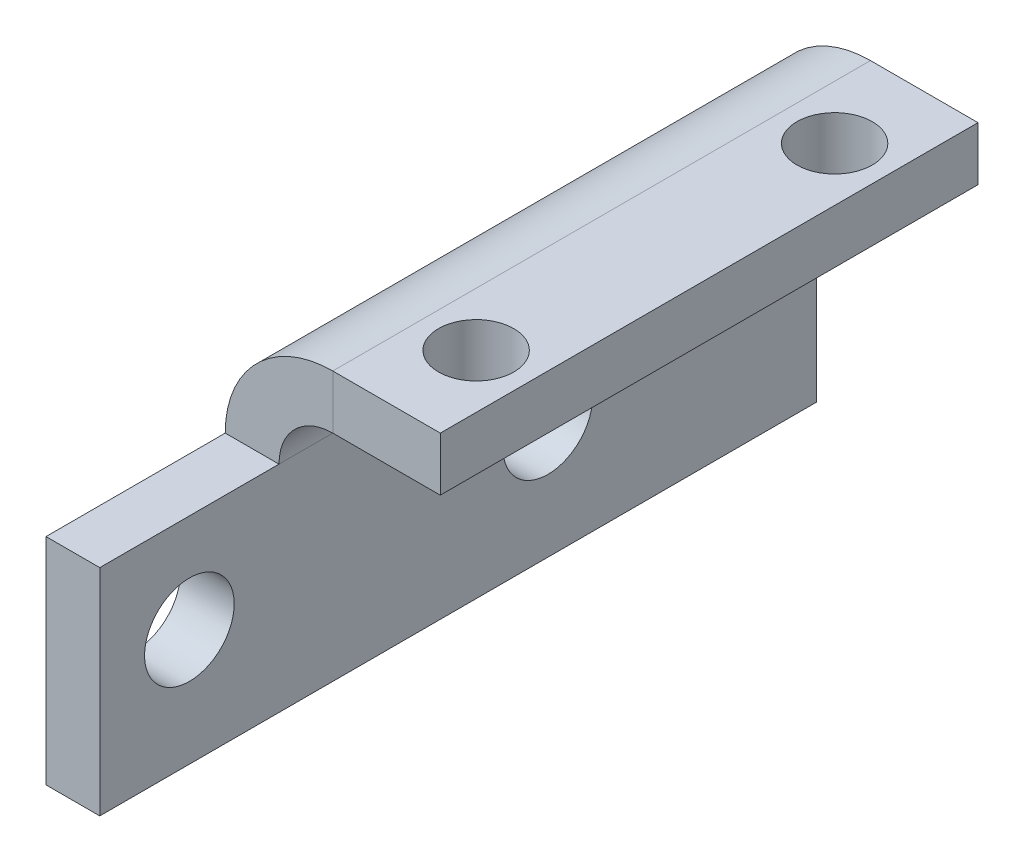
ISO-10303-21;
HEADER;
FILE_DESCRIPTION(('STEP AP214'),'2;1');
FILE_NAME('part.step','',(''),(''),'','','');
FILE_SCHEMA(('AUTOMOTIVE_DESIGN { 1 0 10303 214 1 1 1 1 }'));
ENDSEC;
DATA;
#1=APPLICATION_CONTEXT('core data for automotive mechanical design processes');
#2=APPLICATION_PROTOCOL_DEFINITION('international standard','automotive_design',2000,#1);
#3=PRODUCT_CONTEXT('',#1,'mechanical');
#4=PRODUCT('Part','Part','',(#3));
#5=PRODUCT_RELATED_PRODUCT_CATEGORY('part','',(#4));
#6=PRODUCT_DEFINITION_FORMATION('','',#4);
#7=PRODUCT_DEFINITION_CONTEXT('part definition',#1,'design');
#8=PRODUCT_DEFINITION('design','',#6,#7);
#9=PRODUCT_DEFINITION_SHAPE('','',#8);
#10=(LENGTH_UNIT() NAMED_UNIT(*) SI_UNIT(.MILLI.,.METRE.));
#11=(NAMED_UNIT(*) PLANE_ANGLE_UNIT() SI_UNIT($,.RADIAN.));
#12=(NAMED_UNIT(*) SI_UNIT($,.STERADIAN.) SOLID_ANGLE_UNIT());
#13=UNCERTAINTY_MEASURE_WITH_UNIT(LENGTH_MEASURE(1.E-05),#10,'distance_accuracy_value','');
#14=(GEOMETRIC_REPRESENTATION_CONTEXT(3) GLOBAL_UNCERTAINTY_ASSIGNED_CONTEXT((#13)) GLOBAL_UNIT_ASSIGNED_CONTEXT((#10,
#11,#12)) REPRESENTATION_CONTEXT('',''));
#15=CARTESIAN_POINT('',(0.,0.,0.));
#16=DIRECTION('',(0.,0.,1.));
#17=DIRECTION('',(1.,0.,0.));
#18=AXIS2_PLACEMENT_3D('',#15,#16,#17);
#19=CARTESIAN_POINT('',(-3.,18.,0.));
#20=DIRECTION('',(0.,-1.,0.));
#21=DIRECTION('',(0.,0.,1.));
#22=AXIS2_PLACEMENT_3D('',#19,#20,#21);
#23=PLANE('',#22);
#24=DIRECTION('',(0.,0.,1.));
#25=VECTOR('',#24,1.);
#26=CARTESIAN_POINT('',(-3.,18.,0.));
#27=LINE('',#26,#25);
#28=CARTESIAN_POINT('',(-3.,18.,-30.));
#29=VERTEX_POINT('',#28);
#30=CARTESIAN_POINT('',(-3.,18.,10.));
#31=VERTEX_POINT('',#30);
#32=EDGE_CURVE('E164',#29,#31,#27,.T.);
#33=ORIENTED_EDGE('',*,*,#32,.F.);
#34=DIRECTION('',(-1.,0.,0.));
#35=VECTOR('',#34,1.);
#36=CARTESIAN_POINT('',(-3.,18.,-30.));
#37=LINE('',#36,#35);
#38=CARTESIAN_POINT('',(0.,18.,-30.));
#39=VERTEX_POINT('',#38);
#40=EDGE_CURVE('E57',#39,#29,#37,.T.);
#41=ORIENTED_EDGE('',*,*,#40,.F.);
#42=DIRECTION('',(0.,0.,-1.));
#43=VECTOR('',#42,1.);
#44=CARTESIAN_POINT('',(0.,18.,0.));
#45=LINE('',#44,#43);
#46=CARTESIAN_POINT('',(0.,18.,10.));
#47=VERTEX_POINT('',#46);
#48=EDGE_CURVE('E131',#39,#47,#45,.F.);
#49=ORIENTED_EDGE('',*,*,#48,.T.);
#50=DIRECTION('',(-1.,0.,0.));
#51=VECTOR('',#50,1.);
#52=CARTESIAN_POINT('',(-3.,18.,10.));
#53=LINE('',#52,#51);
#54=EDGE_CURVE('E106',#47,#31,#53,.T.);
#55=ORIENTED_EDGE('',*,*,#54,.T.);
#56=EDGE_LOOP('',(#33,#41,#49,#55));
#57=FACE_BOUND('',#56,.T.);
#58=ADVANCED_FACE('F47',(#57),#23,.T.);
#59=CARTESIAN_POINT('',(-3.,18.,-30.));
#60=DIRECTION('',(0.,0.,1.));
#61=DIRECTION('',(0.,1.,0.));
#62=AXIS2_PLACEMENT_3D('',#59,#60,#61);
#63=PLANE('',#62);
#64=ORIENTED_EDGE('',*,*,#40,.T.);
#65=DIRECTION('',(0.,1.,0.));
#66=VECTOR('',#65,1.);
#67=CARTESIAN_POINT('',(-3.,18.,-30.));
#68=LINE('',#67,#66);
#69=CARTESIAN_POINT('',(-3.,30.,-30.));
#70=VERTEX_POINT('',#69);
#71=EDGE_CURVE('E157',#29,#70,#68,.T.);
#72=ORIENTED_EDGE('',*,*,#71,.T.);
#73=DIRECTION('',(-1.,0.,0.));
#74=VECTOR('',#73,1.);
#75=CARTESIAN_POINT('',(-3.,30.,-30.));
#76=LINE('',#75,#74);
#77=CARTESIAN_POINT('',(0.,30.,-30.));
#78=VERTEX_POINT('',#77);
#79=EDGE_CURVE('E147',#78,#70,#76,.T.);
#80=ORIENTED_EDGE('',*,*,#79,.F.);
#81=DIRECTION('',(0.,-1.,0.));
#82=VECTOR('',#81,1.);
#83=CARTESIAN_POINT('',(0.,18.,-30.));
#84=LINE('',#83,#82);
#85=EDGE_CURVE('E112',#39,#78,#84,.F.);
#86=ORIENTED_EDGE('',*,*,#85,.F.);
#87=EDGE_LOOP('',(#64,#72,#80,#86));
#88=FACE_BOUND('',#87,.T.);
#89=ADVANCED_FACE('F155',(#88),#63,.F.);
#90=CARTESIAN_POINT('',(3.,30.,-30.));
#91=DIRECTION('',(0.,0.,-1.));
#92=DIRECTION('',(-1.,0.,0.));
#93=AXIS2_PLACEMENT_3D('',#90,#91,#92);
#94=PLANE('',#93);
#95=ORIENTED_EDGE('',*,*,#79,.T.);
#96=CARTESIAN_POINT('',(3.,30.,-30.));
#97=DIRECTION('',(0.,0.,-1.));
#98=DIRECTION('',(1.,0.,0.));
#99=AXIS2_PLACEMENT_3D('',#96,#97,#98);
#100=CIRCLE('',#99,6.);
#101=CARTESIAN_POINT('',(3.,36.,-30.));
#102=VERTEX_POINT('',#101);
#103=EDGE_CURVE('E168',#70,#102,#100,.T.);
#104=ORIENTED_EDGE('',*,*,#103,.T.);
#105=DIRECTION('',(0.,1.,0.));
#106=VECTOR('',#105,1.);
#107=CARTESIAN_POINT('',(3.,36.,-30.));
#108=LINE('',#107,#106);
#109=CARTESIAN_POINT('',(3.,33.,-30.));
#110=VERTEX_POINT('',#109);
#111=EDGE_CURVE('E144',#110,#102,#108,.T.);
#112=ORIENTED_EDGE('',*,*,#111,.F.);
#113=CARTESIAN_POINT('',(3.,30.,-30.));
#114=DIRECTION('',(0.,0.,1.));
#115=DIRECTION('',(-1.,0.,0.));
#116=AXIS2_PLACEMENT_3D('',#113,#114,#115);
#117=CIRCLE('',#116,3.);
#118=EDGE_CURVE('E129',#78,#110,#117,.F.);
#119=ORIENTED_EDGE('',*,*,#118,.F.);
#120=EDGE_LOOP('',(#95,#104,#112,#119));
#121=FACE_BOUND('',#120,.T.);
#122=ADVANCED_FACE('F247',(#121),#94,.T.);
#123=CARTESIAN_POINT('',(0.,36.,-30.));
#124=DIRECTION('',(0.,0.,1.));
#125=DIRECTION('',(-1.,0.,0.));
#126=AXIS2_PLACEMENT_3D('',#123,#124,#125);
#127=PLANE('',#126);
#128=ORIENTED_EDGE('',*,*,#111,.T.);
#129=DIRECTION('',(-1.,0.,0.));
#130=VECTOR('',#129,1.);
#131=CARTESIAN_POINT('',(0.,36.,-30.));
#132=LINE('',#131,#130);
#133=CARTESIAN_POINT('',(9.,36.,-30.));
#134=VERTEX_POINT('',#133);
#135=EDGE_CURVE('E183',#134,#102,#132,.T.);
#136=ORIENTED_EDGE('',*,*,#135,.F.);
#137=DIRECTION('',(0.,1.,0.));
#138=VECTOR('',#137,1.);
#139=CARTESIAN_POINT('',(9.,36.,-30.));
#140=LINE('',#139,#138);
#141=CARTESIAN_POINT('',(9.,33.,-30.));
#142=VERTEX_POINT('',#141);
#143=EDGE_CURVE('E141',#142,#134,#140,.T.);
#144=ORIENTED_EDGE('',*,*,#143,.F.);
#145=DIRECTION('',(1.,0.,0.));
#146=VECTOR('',#145,1.);
#147=CARTESIAN_POINT('',(0.,33.,-30.));
#148=LINE('',#147,#146);
#149=EDGE_CURVE('E202',#142,#110,#148,.F.);
#150=ORIENTED_EDGE('',*,*,#149,.T.);
#151=EDGE_LOOP('',(#128,#136,#144,#150));
#152=FACE_BOUND('',#151,.T.);
#153=ADVANCED_FACE('F252',(#152),#127,.F.);
#154=CARTESIAN_POINT('',(9.,36.,0.));
#155=DIRECTION('',(-1.,0.,0.));
#156=DIRECTION('',(0.,0.,-1.));
#157=AXIS2_PLACEMENT_3D('',#154,#155,#156);
#158=PLANE('',#157);
#159=ORIENTED_EDGE('',*,*,#143,.T.);
#160=DIRECTION('',(0.,0.,-1.));
#161=VECTOR('',#160,1.);
#162=CARTESIAN_POINT('',(9.,36.,0.));
#163=LINE('',#162,#161);
#164=CARTESIAN_POINT('',(9.,36.,0.));
#165=VERTEX_POINT('',#164);
#166=EDGE_CURVE('E185',#165,#134,#163,.T.);
#167=ORIENTED_EDGE('',*,*,#166,.F.);
#168=DIRECTION('',(0.,1.,0.));
#169=VECTOR('',#168,1.);
#170=CARTESIAN_POINT('',(9.,36.,0.));
#171=LINE('',#170,#169);
#172=CARTESIAN_POINT('',(9.,33.,0.));
#173=VERTEX_POINT('',#172);
#174=EDGE_CURVE('E138',#173,#165,#171,.T.);
#175=ORIENTED_EDGE('',*,*,#174,.F.);
#176=DIRECTION('',(0.,0.,-1.));
#177=VECTOR('',#176,1.);
#178=CARTESIAN_POINT('',(9.,33.,0.));
#179=LINE('',#178,#177);
#180=EDGE_CURVE('E119',#173,#142,#179,.T.);
#181=ORIENTED_EDGE('',*,*,#180,.T.);
#182=EDGE_LOOP('',(#159,#167,#175,#181));
#183=FACE_BOUND('',#182,.T.);
#184=ADVANCED_FACE('F256',(#183),#158,.F.);
#185=CARTESIAN_POINT('',(0.,36.,0.));
#186=DIRECTION('',(0.,0.,-1.));
#187=DIRECTION('',(1.,0.,0.));
#188=AXIS2_PLACEMENT_3D('',#185,#186,#187);
#189=PLANE('',#188);
#190=ORIENTED_EDGE('',*,*,#174,.T.);
#191=DIRECTION('',(1.,0.,0.));
#192=VECTOR('',#191,1.);
#193=CARTESIAN_POINT('',(0.,36.,0.));
#194=LINE('',#193,#192);
#195=CARTESIAN_POINT('',(3.,36.,0.));
#196=VERTEX_POINT('',#195);
#197=EDGE_CURVE('E180',#196,#165,#194,.T.);
#198=ORIENTED_EDGE('',*,*,#197,.F.);
#199=DIRECTION('',(0.,1.,0.));
#200=VECTOR('',#199,1.);
#201=CARTESIAN_POINT('',(3.,36.,0.));
#202=LINE('',#201,#200);
#203=CARTESIAN_POINT('',(3.,33.,0.));
#204=VERTEX_POINT('',#203);
#205=EDGE_CURVE('E51',#204,#196,#202,.T.);
#206=ORIENTED_EDGE('',*,*,#205,.F.);
#207=DIRECTION('',(1.,0.,0.));
#208=VECTOR('',#207,1.);
#209=CARTESIAN_POINT('',(0.,33.,0.));
#210=LINE('',#209,#208);
#211=EDGE_CURVE('E200',#204,#173,#210,.T.);
#212=ORIENTED_EDGE('',*,*,#211,.T.);
#213=EDGE_LOOP('',(#190,#198,#206,#212));
#214=FACE_BOUND('',#213,.T.);
#215=ADVANCED_FACE('F260',(#214),#189,.F.);
#216=CARTESIAN_POINT('',(6.,36.,-5.));
#217=DIRECTION('',(0.,1.,0.));
#218=DIRECTION('',(0.,0.,-1.));
#219=AXIS2_PLACEMENT_3D('',#216,#217,#218);
#220=CYLINDRICAL_SURFACE('',#219,2.1);
#221=CARTESIAN_POINT('',(6.,36.,-5.));
#222=DIRECTION('',(0.,1.,0.));
#223=DIRECTION('',(0.,0.,1.));
#224=AXIS2_PLACEMENT_3D('',#221,#222,#223);
#225=CIRCLE('',#224,2.1);
#226=CARTESIAN_POINT('',(6.,36.,-2.9));
#227=VERTEX_POINT('',#226);
#228=EDGE_CURVE('E170',#227,#227,#225,.T.);
#229=ORIENTED_EDGE('',*,*,#228,.T.);
#230=EDGE_LOOP('',(#229));
#231=FACE_BOUND('',#230,.T.);
#232=CARTESIAN_POINT('',(6.,33.,-5.));
#233=DIRECTION('',(0.,1.,0.));
#234=DIRECTION('',(0.,0.,1.));
#235=AXIS2_PLACEMENT_3D('',#232,#233,#234);
#236=CIRCLE('',#235,2.1);
#237=CARTESIAN_POINT('',(6.,33.,-2.9));
#238=VERTEX_POINT('',#237);
#239=EDGE_CURVE('E194',#238,#238,#236,.T.);
#240=ORIENTED_EDGE('',*,*,#239,.F.);
#241=EDGE_LOOP('',(#240));
#242=FACE_BOUND('',#241,.T.);
#243=ADVANCED_FACE('F264',(#231,#242),#220,.F.);
#244=CARTESIAN_POINT('',(6.,36.,-25.));
#245=DIRECTION('',(0.,1.,0.));
#246=DIRECTION('',(0.,0.,-1.));
#247=AXIS2_PLACEMENT_3D('',#244,#245,#246);
#248=CYLINDRICAL_SURFACE('',#247,2.1);
#249=CARTESIAN_POINT('',(6.,36.,-25.));
#250=DIRECTION('',(0.,1.,0.));
#251=DIRECTION('',(0.,0.,1.));
#252=AXIS2_PLACEMENT_3D('',#249,#250,#251);
#253=CIRCLE('',#252,2.1);
#254=CARTESIAN_POINT('',(6.,36.,-22.9));
#255=VERTEX_POINT('',#254);
#256=EDGE_CURVE('E177',#255,#255,#253,.T.);
#257=ORIENTED_EDGE('',*,*,#256,.T.);
#258=EDGE_LOOP('',(#257));
#259=FACE_BOUND('',#258,.T.);
#260=CARTESIAN_POINT('',(6.,33.,-25.));
#261=DIRECTION('',(0.,1.,0.));
#262=DIRECTION('',(0.,0.,1.));
#263=AXIS2_PLACEMENT_3D('',#260,#261,#262);
#264=CIRCLE('',#263,2.1);
#265=CARTESIAN_POINT('',(6.,33.,-22.9));
#266=VERTEX_POINT('',#265);
#267=EDGE_CURVE('E197',#266,#266,#264,.T.);
#268=ORIENTED_EDGE('',*,*,#267,.F.);
#269=EDGE_LOOP('',(#268));
#270=FACE_BOUND('',#269,.T.);
#271=ADVANCED_FACE('F266',(#259,#270),#248,.F.);
#272=CARTESIAN_POINT('',(3.,30.,0.));
#273=DIRECTION('',(0.,0.,-1.));
#274=DIRECTION('',(-1.,0.,0.));
#275=AXIS2_PLACEMENT_3D('',#272,#273,#274);
#276=PLANE('',#275);
#277=CARTESIAN_POINT('',(3.,30.,0.));
#278=DIRECTION('',(0.,0.,1.));
#279=DIRECTION('',(-1.,0.,0.));
#280=AXIS2_PLACEMENT_3D('',#277,#278,#279);
#281=CIRCLE('',#280,3.);
#282=CARTESIAN_POINT('',(0.,30.,0.));
#283=VERTEX_POINT('',#282);
#284=EDGE_CURVE('E124',#204,#283,#281,.T.);
#285=ORIENTED_EDGE('',*,*,#284,.F.);
#286=ORIENTED_EDGE('',*,*,#205,.T.);
#287=CARTESIAN_POINT('',(3.,30.,0.));
#288=DIRECTION('',(0.,0.,-1.));
#289=DIRECTION('',(1.,0.,0.));
#290=AXIS2_PLACEMENT_3D('',#287,#288,#289);
#291=CIRCLE('',#290,6.);
#292=CARTESIAN_POINT('',(-3.,30.,0.));
#293=VERTEX_POINT('',#292);
#294=EDGE_CURVE('E126',#196,#293,#291,.F.);
#295=ORIENTED_EDGE('',*,*,#294,.T.);
#296=DIRECTION('',(-1.,0.,0.));
#297=VECTOR('',#296,1.);
#298=CARTESIAN_POINT('',(-3.,30.,0.));
#299=LINE('',#298,#297);
#300=EDGE_CURVE('E11',#283,#293,#299,.T.);
#301=ORIENTED_EDGE('',*,*,#300,.F.);
#302=EDGE_LOOP('',(#285,#286,#295,#301));
#303=FACE_BOUND('',#302,.T.);
#304=ADVANCED_FACE('F49',(#303),#276,.F.);
#305=CARTESIAN_POINT('',(0.,36.,0.));
#306=DIRECTION('',(0.,1.,0.));
#307=DIRECTION('',(0.,0.,-1.));
#308=AXIS2_PLACEMENT_3D('',#305,#306,#307);
#309=PLANE('',#308);
#310=ORIENTED_EDGE('',*,*,#228,.F.);
#311=EDGE_LOOP('',(#310));
#312=FACE_BOUND('',#311,.T.);
#313=ORIENTED_EDGE('',*,*,#256,.F.);
#314=EDGE_LOOP('',(#313));
#315=FACE_BOUND('',#314,.T.);
#316=ORIENTED_EDGE('',*,*,#197,.T.);
#317=ORIENTED_EDGE('',*,*,#166,.T.);
#318=ORIENTED_EDGE('',*,*,#135,.T.);
#319=DIRECTION('',(0.,0.,1.));
#320=VECTOR('',#319,1.);
#321=CARTESIAN_POINT('',(3.,36.,-30.));
#322=LINE('',#321,#320);
#323=EDGE_CURVE('E65',#196,#102,#322,.F.);
#324=ORIENTED_EDGE('',*,*,#323,.F.);
#325=EDGE_LOOP('',(#316,#317,#318,#324));
#326=FACE_BOUND('',#325,.T.);
#327=ADVANCED_FACE('F285',(#312,#315,#326),#309,.T.);
#328=CARTESIAN_POINT('',(-3.,18.,0.));
#329=DIRECTION('',(1.,0.,0.));
#330=DIRECTION('',(0.,0.,-1.));
#331=AXIS2_PLACEMENT_3D('',#328,#329,#330);
#332=PLANE('',#331);
#333=CARTESIAN_POINT('',(-3.,24.5,5.));
#334=DIRECTION('',(-1.,0.,0.));
#335=DIRECTION('',(0.,0.,-1.));
#336=AXIS2_PLACEMENT_3D('',#333,#334,#335);
#337=CIRCLE('',#336,2.5);
#338=CARTESIAN_POINT('',(-3.,24.5,2.5));
#339=VERTEX_POINT('',#338);
#340=EDGE_CURVE('E217',#339,#339,#337,.F.);
#341=ORIENTED_EDGE('',*,*,#340,.T.);
#342=EDGE_LOOP('',(#341));
#343=FACE_BOUND('',#342,.T.);
#344=CARTESIAN_POINT('',(-3.,24.5,-15.));
#345=DIRECTION('',(-1.,0.,0.));
#346=DIRECTION('',(0.,0.,-1.));
#347=AXIS2_PLACEMENT_3D('',#344,#345,#346);
#348=CIRCLE('',#347,2.49999999999999);
#349=CARTESIAN_POINT('',(-3.,24.5,-17.5));
#350=VERTEX_POINT('',#349);
#351=EDGE_CURVE('E222',#350,#350,#348,.F.);
#352=ORIENTED_EDGE('',*,*,#351,.T.);
#353=EDGE_LOOP('',(#352));
#354=FACE_BOUND('',#353,.T.);
#355=ORIENTED_EDGE('',*,*,#71,.F.);
#356=ORIENTED_EDGE('',*,*,#32,.T.);
#357=DIRECTION('',(0.,1.,0.));
#358=VECTOR('',#357,1.);
#359=CARTESIAN_POINT('',(-3.,18.,10.));
#360=LINE('',#359,#358);
#361=CARTESIAN_POINT('',(-3.,30.,10.));
#362=VERTEX_POINT('',#361);
#363=EDGE_CURVE('E212',#31,#362,#360,.T.);
#364=ORIENTED_EDGE('',*,*,#363,.T.);
#365=DIRECTION('',(0.,0.,-1.));
#366=VECTOR('',#365,1.);
#367=CARTESIAN_POINT('',(-3.,30.,10.));
#368=LINE('',#367,#366);
#369=EDGE_CURVE('E105',#362,#293,#368,.T.);
#370=ORIENTED_EDGE('',*,*,#369,.T.);
#371=DIRECTION('',(0.,0.,1.));
#372=VECTOR('',#371,1.);
#373=CARTESIAN_POINT('',(-3.,30.,0.));
#374=LINE('',#373,#372);
#375=EDGE_CURVE('E188',#70,#293,#374,.T.);
#376=ORIENTED_EDGE('',*,*,#375,.F.);
#377=EDGE_LOOP('',(#355,#356,#364,#370,#376));
#378=FACE_BOUND('',#377,.T.);
#379=ADVANCED_FACE('F284',(#343,#354,#378),#332,.F.);
#380=CARTESIAN_POINT('',(3.,30.,0.));
#381=DIRECTION('',(0.,0.,-1.));
#382=DIRECTION('',(-1.,0.,0.));
#383=AXIS2_PLACEMENT_3D('',#380,#381,#382);
#384=CYLINDRICAL_SURFACE('',#383,6.);
#385=ORIENTED_EDGE('',*,*,#103,.F.);
#386=ORIENTED_EDGE('',*,*,#375,.T.);
#387=ORIENTED_EDGE('',*,*,#294,.F.);
#388=ORIENTED_EDGE('',*,*,#323,.T.);
#389=EDGE_LOOP('',(#385,#386,#387,#388));
#390=FACE_BOUND('',#389,.T.);
#391=ADVANCED_FACE('F280',(#390),#384,.T.);
#392=CARTESIAN_POINT('',(0.,33.,0.));
#393=DIRECTION('',(0.,1.,0.));
#394=DIRECTION('',(0.,0.,-1.));
#395=AXIS2_PLACEMENT_3D('',#392,#393,#394);
#396=PLANE('',#395);
#397=ORIENTED_EDGE('',*,*,#239,.T.);
#398=EDGE_LOOP('',(#397));
#399=FACE_BOUND('',#398,.T.);
#400=ORIENTED_EDGE('',*,*,#267,.T.);
#401=EDGE_LOOP('',(#400));
#402=FACE_BOUND('',#401,.T.);
#403=ORIENTED_EDGE('',*,*,#211,.F.);
#404=DIRECTION('',(0.,0.,-1.));
#405=VECTOR('',#404,1.);
#406=CARTESIAN_POINT('',(3.,33.,0.));
#407=LINE('',#406,#405);
#408=EDGE_CURVE('E118',#204,#110,#407,.T.);
#409=ORIENTED_EDGE('',*,*,#408,.T.);
#410=ORIENTED_EDGE('',*,*,#149,.F.);
#411=ORIENTED_EDGE('',*,*,#180,.F.);
#412=EDGE_LOOP('',(#403,#409,#410,#411));
#413=FACE_BOUND('',#412,.T.);
#414=ADVANCED_FACE('F277',(#399,#402,#413),#396,.F.);
#415=CARTESIAN_POINT('',(0.,18.,0.));
#416=DIRECTION('',(1.,0.,0.));
#417=DIRECTION('',(0.,0.,-1.));
#418=AXIS2_PLACEMENT_3D('',#415,#416,#417);
#419=PLANE('',#418);
#420=CARTESIAN_POINT('',(0.,24.5,5.));
#421=DIRECTION('',(-1.,0.,0.));
#422=DIRECTION('',(0.,0.,-1.));
#423=AXIS2_PLACEMENT_3D('',#420,#421,#422);
#424=CIRCLE('',#423,2.5);
#425=CARTESIAN_POINT('',(0.,24.5,2.5));
#426=VERTEX_POINT('',#425);
#427=EDGE_CURVE('E221',#426,#426,#424,.T.);
#428=ORIENTED_EDGE('',*,*,#427,.T.);
#429=EDGE_LOOP('',(#428));
#430=FACE_BOUND('',#429,.T.);
#431=CARTESIAN_POINT('',(0.,24.5,-15.));
#432=DIRECTION('',(-1.,0.,0.));
#433=DIRECTION('',(0.,0.,-1.));
#434=AXIS2_PLACEMENT_3D('',#431,#432,#433);
#435=CIRCLE('',#434,2.49999999999999);
#436=CARTESIAN_POINT('',(0.,24.5,-17.5));
#437=VERTEX_POINT('',#436);
#438=EDGE_CURVE('E218',#437,#437,#435,.T.);
#439=ORIENTED_EDGE('',*,*,#438,.T.);
#440=EDGE_LOOP('',(#439));
#441=FACE_BOUND('',#440,.T.);
#442=ORIENTED_EDGE('',*,*,#85,.T.);
#443=DIRECTION('',(0.,0.,-1.));
#444=VECTOR('',#443,1.);
#445=CARTESIAN_POINT('',(0.,30.,0.));
#446=LINE('',#445,#444);
#447=EDGE_CURVE('E109',#78,#283,#446,.F.);
#448=ORIENTED_EDGE('',*,*,#447,.T.);
#449=DIRECTION('',(0.,0.,-1.));
#450=VECTOR('',#449,1.);
#451=CARTESIAN_POINT('',(0.,30.,10.));
#452=LINE('',#451,#450);
#453=CARTESIAN_POINT('',(0.,30.,10.));
#454=VERTEX_POINT('',#453);
#455=EDGE_CURVE('E92',#454,#283,#452,.T.);
#456=ORIENTED_EDGE('',*,*,#455,.F.);
#457=DIRECTION('',(0.,-1.,0.));
#458=VECTOR('',#457,1.);
#459=CARTESIAN_POINT('',(0.,18.,10.));
#460=LINE('',#459,#458);
#461=EDGE_CURVE('E207',#454,#47,#460,.T.);
#462=ORIENTED_EDGE('',*,*,#461,.T.);
#463=ORIENTED_EDGE('',*,*,#48,.F.);
#464=EDGE_LOOP('',(#442,#448,#456,#462,#463));
#465=FACE_BOUND('',#464,.T.);
#466=ADVANCED_FACE('F110',(#430,#441,#465),#419,.T.);
#467=CARTESIAN_POINT('',(3.,30.,0.));
#468=DIRECTION('',(0.,0.,-1.));
#469=DIRECTION('',(-1.,0.,0.));
#470=AXIS2_PLACEMENT_3D('',#467,#468,#469);
#471=CYLINDRICAL_SURFACE('',#470,3.);
#472=ORIENTED_EDGE('',*,*,#118,.T.);
#473=ORIENTED_EDGE('',*,*,#408,.F.);
#474=ORIENTED_EDGE('',*,*,#284,.T.);
#475=ORIENTED_EDGE('',*,*,#447,.F.);
#476=EDGE_LOOP('',(#472,#473,#474,#475));
#477=FACE_BOUND('',#476,.T.);
#478=ADVANCED_FACE('F128',(#477),#471,.F.);
#479=CARTESIAN_POINT('',(-3.,30.,10.));
#480=DIRECTION('',(0.,-1.,0.));
#481=DIRECTION('',(0.,0.,1.));
#482=AXIS2_PLACEMENT_3D('',#479,#480,#481);
#483=PLANE('',#482);
#484=ORIENTED_EDGE('',*,*,#300,.T.);
#485=ORIENTED_EDGE('',*,*,#369,.F.);
#486=DIRECTION('',(1.,0.,0.));
#487=VECTOR('',#486,1.);
#488=CARTESIAN_POINT('',(-3.,30.,10.));
#489=LINE('',#488,#487);
#490=EDGE_CURVE('E101',#362,#454,#489,.T.);
#491=ORIENTED_EDGE('',*,*,#490,.T.);
#492=ORIENTED_EDGE('',*,*,#455,.T.);
#493=EDGE_LOOP('',(#484,#485,#491,#492));
#494=FACE_BOUND('',#493,.T.);
#495=ADVANCED_FACE('F94',(#494),#483,.F.);
#496=CARTESIAN_POINT('',(0.,36.,10.));
#497=DIRECTION('',(0.,0.,1.));
#498=DIRECTION('',(1.,0.,0.));
#499=AXIS2_PLACEMENT_3D('',#496,#497,#498);
#500=PLANE('',#499);
#501=ORIENTED_EDGE('',*,*,#363,.F.);
#502=ORIENTED_EDGE('',*,*,#54,.F.);
#503=ORIENTED_EDGE('',*,*,#461,.F.);
#504=ORIENTED_EDGE('',*,*,#490,.F.);
#505=EDGE_LOOP('',(#501,#502,#503,#504));
#506=FACE_BOUND('',#505,.T.);
#507=ADVANCED_FACE('F211',(#506),#500,.T.);
#508=CARTESIAN_POINT('',(-10.0710678118655,24.5,-15.));
#509=DIRECTION('',(1.,0.,0.));
#510=DIRECTION('',(0.,0.,-1.));
#511=AXIS2_PLACEMENT_3D('',#508,#509,#510);
#512=CYLINDRICAL_SURFACE('',#511,2.49999999999999);
#513=ORIENTED_EDGE('',*,*,#351,.F.);
#514=EDGE_LOOP('',(#513));
#515=FACE_BOUND('',#514,.T.);
#516=ORIENTED_EDGE('',*,*,#438,.F.);
#517=EDGE_LOOP('',(#516));
#518=FACE_BOUND('',#517,.T.);
#519=ADVANCED_FACE('F234',(#515,#518),#512,.F.);
#520=CARTESIAN_POINT('',(-10.0710678118655,24.5,5.));
#521=DIRECTION('',(1.,0.,0.));
#522=DIRECTION('',(0.,0.,-1.));
#523=AXIS2_PLACEMENT_3D('',#520,#521,#522);
#524=CYLINDRICAL_SURFACE('',#523,2.5);
#525=ORIENTED_EDGE('',*,*,#340,.F.);
#526=EDGE_LOOP('',(#525));
#527=FACE_BOUND('',#526,.T.);
#528=ORIENTED_EDGE('',*,*,#427,.F.);
#529=EDGE_LOOP('',(#528));
#530=FACE_BOUND('',#529,.T.);
#531=ADVANCED_FACE('F232',(#527,#530),#524,.F.);
#532=CLOSED_SHELL('',(#58,#89,#122,#153,#184,#215,#243,#271,#304,#327,#379,#391,#414,#466,#478,
#495,#507,#519,#531));
#533=MANIFOLD_SOLID_BREP('B2',#532);
#534=ADVANCED_BREP_SHAPE_REPRESENTATION('',(#18,#533),#14);
#535=SHAPE_DEFINITION_REPRESENTATION(#9,#534);
ENDSEC;
END-ISO-10303-21;
